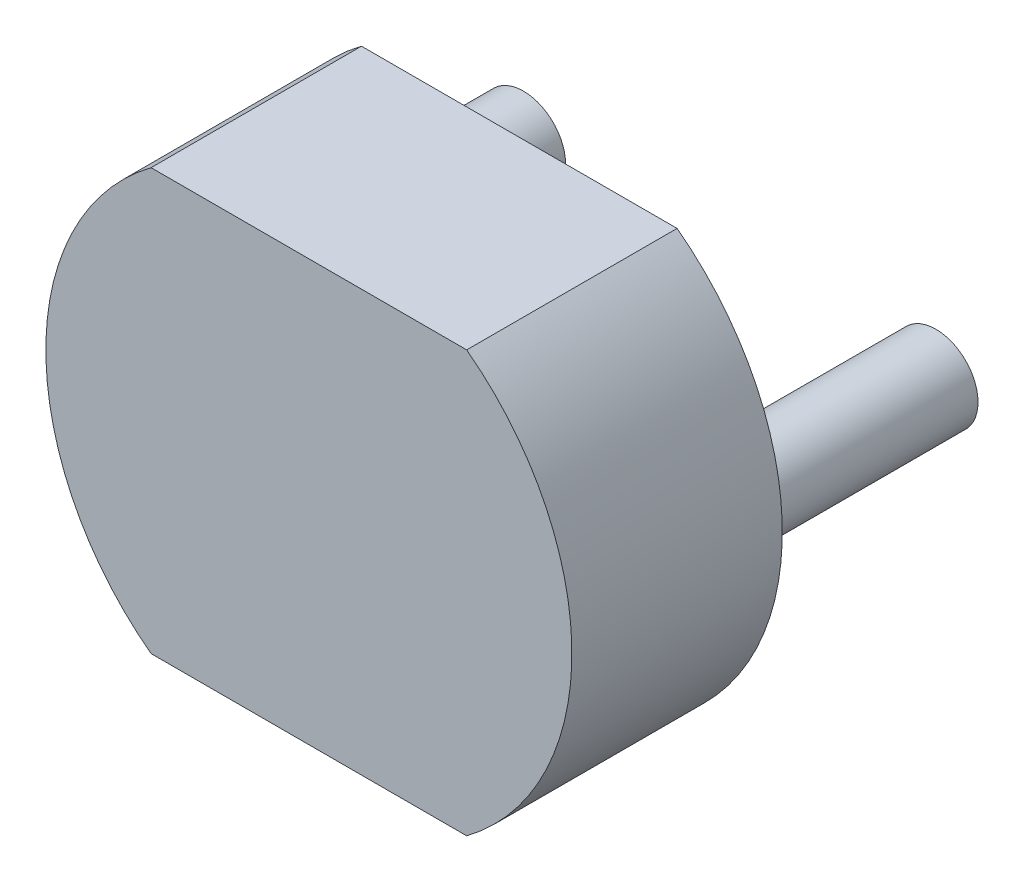
ISO-10303-21;
HEADER;
FILE_DESCRIPTION(('STEP AP214'),'2;1');
FILE_NAME('part.step','',(''),(''),'','','');
FILE_SCHEMA(('AUTOMOTIVE_DESIGN { 1 0 10303 214 1 1 1 1 }'));
ENDSEC;
DATA;
#1=APPLICATION_CONTEXT('core data for automotive mechanical design processes');
#2=APPLICATION_PROTOCOL_DEFINITION('international standard','automotive_design',2000,#1);
#3=PRODUCT_CONTEXT('',#1,'mechanical');
#4=PRODUCT('Part','Part','',(#3));
#5=PRODUCT_RELATED_PRODUCT_CATEGORY('part','',(#4));
#6=PRODUCT_DEFINITION_FORMATION('','',#4);
#7=PRODUCT_DEFINITION_CONTEXT('part definition',#1,'design');
#8=PRODUCT_DEFINITION('design','',#6,#7);
#9=PRODUCT_DEFINITION_SHAPE('','',#8);
#10=(LENGTH_UNIT() NAMED_UNIT(*) SI_UNIT(.MILLI.,.METRE.));
#11=(NAMED_UNIT(*) PLANE_ANGLE_UNIT() SI_UNIT($,.RADIAN.));
#12=(NAMED_UNIT(*) SI_UNIT($,.STERADIAN.) SOLID_ANGLE_UNIT());
#13=UNCERTAINTY_MEASURE_WITH_UNIT(LENGTH_MEASURE(1.E-05),#10,'distance_accuracy_value','');
#14=(GEOMETRIC_REPRESENTATION_CONTEXT(3) GLOBAL_UNCERTAINTY_ASSIGNED_CONTEXT((#13)) GLOBAL_UNIT_ASSIGNED_CONTEXT((#10,
#11,#12)) REPRESENTATION_CONTEXT('',''));
#15=CARTESIAN_POINT('',(0.,0.,0.));
#16=DIRECTION('',(0.,0.,1.));
#17=DIRECTION('',(1.,0.,0.));
#18=AXIS2_PLACEMENT_3D('',#15,#16,#17);
#19=CARTESIAN_POINT('',(0.,0.,2.));
#20=DIRECTION('',(0.,0.,-1.));
#21=DIRECTION('',(-1.,0.,0.));
#22=AXIS2_PLACEMENT_3D('',#19,#20,#21);
#23=CYLINDRICAL_SURFACE('',#22,2.5);
#24=CARTESIAN_POINT('',(0.,0.,0.));
#25=DIRECTION('',(0.,0.,1.));
#26=DIRECTION('',(1.,0.,0.));
#27=AXIS2_PLACEMENT_3D('',#24,#25,#26);
#28=CIRCLE('',#27,2.5);
#29=CARTESIAN_POINT('',(-1.5,2.,0.));
#30=VERTEX_POINT('',#29);
#31=CARTESIAN_POINT('',(-1.5,-2.,0.));
#32=VERTEX_POINT('',#31);
#33=EDGE_CURVE('E99',#30,#32,#28,.T.);
#34=ORIENTED_EDGE('',*,*,#33,.T.);
#35=DIRECTION('',(0.,0.,-1.));
#36=VECTOR('',#35,1.);
#37=CARTESIAN_POINT('',(-1.5,-2.,2.));
#38=LINE('',#37,#36);
#39=CARTESIAN_POINT('',(-1.5,-2.,2.));
#40=VERTEX_POINT('',#39);
#41=EDGE_CURVE('E91',#40,#32,#38,.T.);
#42=ORIENTED_EDGE('',*,*,#41,.F.);
#43=CARTESIAN_POINT('',(0.,0.,2.));
#44=DIRECTION('',(0.,0.,1.));
#45=DIRECTION('',(1.,0.,0.));
#46=AXIS2_PLACEMENT_3D('',#43,#44,#45);
#47=CIRCLE('',#46,2.5);
#48=CARTESIAN_POINT('',(-1.5,2.,2.));
#49=VERTEX_POINT('',#48);
#50=EDGE_CURVE('E82',#49,#40,#47,.T.);
#51=ORIENTED_EDGE('',*,*,#50,.F.);
#52=DIRECTION('',(0.,0.,-1.));
#53=VECTOR('',#52,1.);
#54=CARTESIAN_POINT('',(-1.5,2.,2.));
#55=LINE('',#54,#53);
#56=EDGE_CURVE('E48',#49,#30,#55,.T.);
#57=ORIENTED_EDGE('',*,*,#56,.T.);
#58=EDGE_LOOP('',(#34,#42,#51,#57));
#59=FACE_BOUND('',#58,.T.);
#60=ADVANCED_FACE('F32',(#59),#23,.T.);
#61=CARTESIAN_POINT('',(0.,-2.,2.));
#62=DIRECTION('',(0.,1.,0.));
#63=DIRECTION('',(0.,0.,1.));
#64=AXIS2_PLACEMENT_3D('',#61,#62,#63);
#65=PLANE('',#64);
#66=DIRECTION('',(1.,0.,0.));
#67=VECTOR('',#66,1.);
#68=CARTESIAN_POINT('',(0.,-2.,0.));
#69=LINE('',#68,#67);
#70=CARTESIAN_POINT('',(1.5,-2.,0.));
#71=VERTEX_POINT('',#70);
#72=EDGE_CURVE('E88',#32,#71,#69,.T.);
#73=ORIENTED_EDGE('',*,*,#72,.T.);
#74=DIRECTION('',(0.,0.,-1.));
#75=VECTOR('',#74,1.);
#76=CARTESIAN_POINT('',(1.5,-2.,2.));
#77=LINE('',#76,#75);
#78=CARTESIAN_POINT('',(1.5,-2.,2.));
#79=VERTEX_POINT('',#78);
#80=EDGE_CURVE('E86',#79,#71,#77,.T.);
#81=ORIENTED_EDGE('',*,*,#80,.F.);
#82=DIRECTION('',(1.,0.,0.));
#83=VECTOR('',#82,1.);
#84=CARTESIAN_POINT('',(0.,-2.,2.));
#85=LINE('',#84,#83);
#86=EDGE_CURVE('E75',#40,#79,#85,.T.);
#87=ORIENTED_EDGE('',*,*,#86,.F.);
#88=ORIENTED_EDGE('',*,*,#41,.T.);
#89=EDGE_LOOP('',(#73,#81,#87,#88));
#90=FACE_BOUND('',#89,.T.);
#91=ADVANCED_FACE('F87',(#90),#65,.F.);
#92=CARTESIAN_POINT('',(0.,0.,2.));
#93=DIRECTION('',(0.,0.,-1.));
#94=DIRECTION('',(-1.,0.,0.));
#95=AXIS2_PLACEMENT_3D('',#92,#93,#94);
#96=CYLINDRICAL_SURFACE('',#95,2.5);
#97=CARTESIAN_POINT('',(0.,0.,0.));
#98=DIRECTION('',(0.,0.,1.));
#99=DIRECTION('',(1.,0.,0.));
#100=AXIS2_PLACEMENT_3D('',#97,#98,#99);
#101=CIRCLE('',#100,2.5);
#102=CARTESIAN_POINT('',(1.5,2.,0.));
#103=VERTEX_POINT('',#102);
#104=EDGE_CURVE('E103',#71,#103,#101,.T.);
#105=ORIENTED_EDGE('',*,*,#104,.T.);
#106=DIRECTION('',(0.,0.,-1.));
#107=VECTOR('',#106,1.);
#108=CARTESIAN_POINT('',(1.5,2.,2.));
#109=LINE('',#108,#107);
#110=CARTESIAN_POINT('',(1.5,2.,2.));
#111=VERTEX_POINT('',#110);
#112=EDGE_CURVE('E63',#111,#103,#109,.T.);
#113=ORIENTED_EDGE('',*,*,#112,.F.);
#114=CARTESIAN_POINT('',(0.,0.,2.));
#115=DIRECTION('',(0.,0.,1.));
#116=DIRECTION('',(1.,0.,0.));
#117=AXIS2_PLACEMENT_3D('',#114,#115,#116);
#118=CIRCLE('',#117,2.5);
#119=EDGE_CURVE('E81',#79,#111,#118,.T.);
#120=ORIENTED_EDGE('',*,*,#119,.F.);
#121=ORIENTED_EDGE('',*,*,#80,.T.);
#122=EDGE_LOOP('',(#105,#113,#120,#121));
#123=FACE_BOUND('',#122,.T.);
#124=ADVANCED_FACE('F93',(#123),#96,.T.);
#125=CARTESIAN_POINT('',(0.,2.,2.));
#126=DIRECTION('',(0.,1.,0.));
#127=DIRECTION('',(0.,0.,1.));
#128=AXIS2_PLACEMENT_3D('',#125,#126,#127);
#129=PLANE('',#128);
#130=DIRECTION('',(1.,0.,0.));
#131=VECTOR('',#130,1.);
#132=CARTESIAN_POINT('',(0.,2.,0.));
#133=LINE('',#132,#131);
#134=EDGE_CURVE('E105',#30,#103,#133,.T.);
#135=ORIENTED_EDGE('',*,*,#134,.F.);
#136=ORIENTED_EDGE('',*,*,#56,.F.);
#137=DIRECTION('',(1.,0.,0.));
#138=VECTOR('',#137,1.);
#139=CARTESIAN_POINT('',(0.,2.,2.));
#140=LINE('',#139,#138);
#141=EDGE_CURVE('E94',#49,#111,#140,.T.);
#142=ORIENTED_EDGE('',*,*,#141,.T.);
#143=ORIENTED_EDGE('',*,*,#112,.T.);
#144=EDGE_LOOP('',(#135,#136,#142,#143));
#145=FACE_BOUND('',#144,.T.);
#146=ADVANCED_FACE('F120',(#145),#129,.T.);
#147=CARTESIAN_POINT('',(0.,0.,2.));
#148=DIRECTION('',(0.,0.,1.));
#149=DIRECTION('',(1.,0.,0.));
#150=AXIS2_PLACEMENT_3D('',#147,#148,#149);
#151=PLANE('',#150);
#152=ORIENTED_EDGE('',*,*,#50,.T.);
#153=ORIENTED_EDGE('',*,*,#86,.T.);
#154=ORIENTED_EDGE('',*,*,#119,.T.);
#155=ORIENTED_EDGE('',*,*,#141,.F.);
#156=EDGE_LOOP('',(#152,#153,#154,#155));
#157=FACE_BOUND('',#156,.T.);
#158=ADVANCED_FACE('F78',(#157),#151,.T.);
#159=CARTESIAN_POINT('',(0.,0.,0.));
#160=DIRECTION('',(0.,0.,1.));
#161=DIRECTION('',(1.,0.,0.));
#162=AXIS2_PLACEMENT_3D('',#159,#160,#161);
#163=PLANE('',#162);
#164=CARTESIAN_POINT('',(-1.96,0.,0.));
#165=DIRECTION('',(0.,0.,1.));
#166=DIRECTION('',(1.,0.,0.));
#167=AXIS2_PLACEMENT_3D('',#164,#165,#166);
#168=CIRCLE('',#167,0.400000000000001);
#169=CARTESIAN_POINT('',(-1.56,0.,0.));
#170=VERTEX_POINT('',#169);
#171=EDGE_CURVE('E11',#170,#170,#168,.F.);
#172=ORIENTED_EDGE('',*,*,#171,.F.);
#173=EDGE_LOOP('',(#172));
#174=FACE_BOUND('',#173,.T.);
#175=CARTESIAN_POINT('',(1.96,0.,0.));
#176=DIRECTION('',(0.,0.,1.));
#177=DIRECTION('',(1.,0.,0.));
#178=AXIS2_PLACEMENT_3D('',#175,#176,#177);
#179=CIRCLE('',#178,0.4);
#180=CARTESIAN_POINT('',(2.36,0.,0.));
#181=VERTEX_POINT('',#180);
#182=EDGE_CURVE('E40',#181,#181,#179,.F.);
#183=ORIENTED_EDGE('',*,*,#182,.F.);
#184=EDGE_LOOP('',(#183));
#185=FACE_BOUND('',#184,.T.);
#186=ORIENTED_EDGE('',*,*,#33,.F.);
#187=ORIENTED_EDGE('',*,*,#134,.T.);
#188=ORIENTED_EDGE('',*,*,#104,.F.);
#189=ORIENTED_EDGE('',*,*,#72,.F.);
#190=EDGE_LOOP('',(#186,#187,#188,#189));
#191=FACE_BOUND('',#190,.T.);
#192=ADVANCED_FACE('F115',(#174,#185,#191),#163,.F.);
#193=CARTESIAN_POINT('',(1.96,0.,-2.));
#194=DIRECTION('',(0.,0.,1.));
#195=DIRECTION('',(1.,0.,0.));
#196=AXIS2_PLACEMENT_3D('',#193,#194,#195);
#197=CYLINDRICAL_SURFACE('',#196,0.4);
#198=CARTESIAN_POINT('',(1.96,0.,-2.));
#199=DIRECTION('',(0.,0.,-1.));
#200=DIRECTION('',(-1.,0.,0.));
#201=AXIS2_PLACEMENT_3D('',#198,#199,#200);
#202=CIRCLE('',#201,0.4);
#203=CARTESIAN_POINT('',(1.56,0.,-2.));
#204=VERTEX_POINT('',#203);
#205=EDGE_CURVE('E101',#204,#204,#202,.T.);
#206=ORIENTED_EDGE('',*,*,#205,.F.);
#207=EDGE_LOOP('',(#206));
#208=FACE_BOUND('',#207,.T.);
#209=ORIENTED_EDGE('',*,*,#182,.T.);
#210=EDGE_LOOP('',(#209));
#211=FACE_BOUND('',#210,.T.);
#212=ADVANCED_FACE('F113',(#208,#211),#197,.T.);
#213=CARTESIAN_POINT('',(1.96,0.,-2.));
#214=DIRECTION('',(0.,0.,-1.));
#215=DIRECTION('',(-1.,0.,0.));
#216=AXIS2_PLACEMENT_3D('',#213,#214,#215);
#217=PLANE('',#216);
#218=ORIENTED_EDGE('',*,*,#205,.T.);
#219=EDGE_LOOP('',(#218));
#220=FACE_BOUND('',#219,.T.);
#221=ADVANCED_FACE('F168',(#220),#217,.T.);
#222=CARTESIAN_POINT('',(-1.96,0.,-2.));
#223=DIRECTION('',(0.,0.,1.));
#224=DIRECTION('',(1.,0.,0.));
#225=AXIS2_PLACEMENT_3D('',#222,#223,#224);
#226=CYLINDRICAL_SURFACE('',#225,0.400000000000001);
#227=CARTESIAN_POINT('',(-1.96,0.,-2.));
#228=DIRECTION('',(0.,0.,-1.));
#229=DIRECTION('',(1.,0.,0.));
#230=AXIS2_PLACEMENT_3D('',#227,#228,#229);
#231=CIRCLE('',#230,0.400000000000001);
#232=CARTESIAN_POINT('',(-1.56,0.,-2.));
#233=VERTEX_POINT('',#232);
#234=EDGE_CURVE('E204',#233,#233,#231,.T.);
#235=ORIENTED_EDGE('',*,*,#234,.F.);
#236=EDGE_LOOP('',(#235));
#237=FACE_BOUND('',#236,.T.);
#238=ORIENTED_EDGE('',*,*,#171,.T.);
#239=EDGE_LOOP('',(#238));
#240=FACE_BOUND('',#239,.T.);
#241=ADVANCED_FACE('F178',(#237,#240),#226,.T.);
#242=CARTESIAN_POINT('',(-1.96,0.,-2.));
#243=DIRECTION('',(0.,0.,1.));
#244=DIRECTION('',(1.,0.,0.));
#245=AXIS2_PLACEMENT_3D('',#242,#243,#244);
#246=PLANE('',#245);
#247=ORIENTED_EDGE('',*,*,#234,.T.);
#248=EDGE_LOOP('',(#247));
#249=FACE_BOUND('',#248,.T.);
#250=ADVANCED_FACE('F188',(#249),#246,.F.);
#251=CLOSED_SHELL('',(#60,#91,#124,#146,#158,#192,#212,#221,#241,#250));
#252=MANIFOLD_SOLID_BREP('B2',#251);
#253=ADVANCED_BREP_SHAPE_REPRESENTATION('',(#18,#252),#14);
#254=SHAPE_DEFINITION_REPRESENTATION(#9,#253);
ENDSEC;
END-ISO-10303-21;
